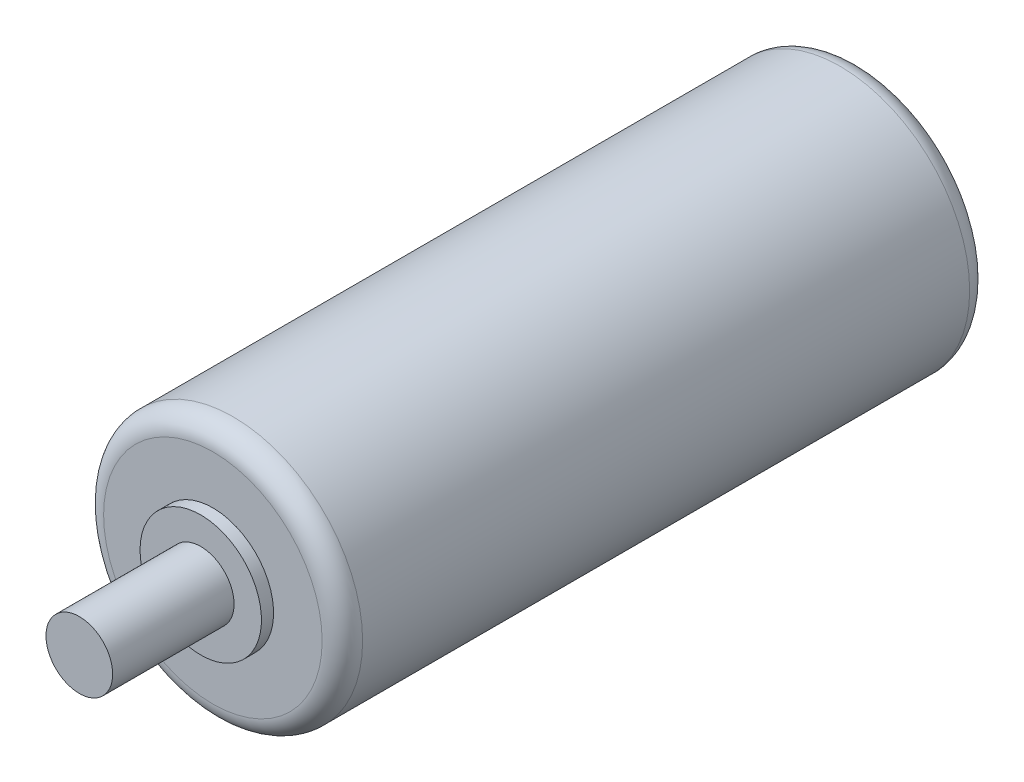
ISO-10303-21;
HEADER;
FILE_DESCRIPTION(('STEP AP214'),'2;1');
FILE_NAME('part.step','',(''),(''),'','','');
FILE_SCHEMA(('AUTOMOTIVE_DESIGN { 1 0 10303 214 1 1 1 1 }'));
ENDSEC;
DATA;
#1=APPLICATION_CONTEXT('core data for automotive mechanical design processes');
#2=APPLICATION_PROTOCOL_DEFINITION('international standard','automotive_design',2000,#1);
#3=PRODUCT_CONTEXT('',#1,'mechanical');
#4=PRODUCT('Part','Part','',(#3));
#5=PRODUCT_RELATED_PRODUCT_CATEGORY('part','',(#4));
#6=PRODUCT_DEFINITION_FORMATION('','',#4);
#7=PRODUCT_DEFINITION_CONTEXT('part definition',#1,'design');
#8=PRODUCT_DEFINITION('design','',#6,#7);
#9=PRODUCT_DEFINITION_SHAPE('','',#8);
#10=(LENGTH_UNIT() NAMED_UNIT(*) SI_UNIT(.MILLI.,.METRE.));
#11=(NAMED_UNIT(*) PLANE_ANGLE_UNIT() SI_UNIT($,.RADIAN.));
#12=(NAMED_UNIT(*) SI_UNIT($,.STERADIAN.) SOLID_ANGLE_UNIT());
#13=UNCERTAINTY_MEASURE_WITH_UNIT(LENGTH_MEASURE(1.E-05),#10,'distance_accuracy_value','');
#14=(GEOMETRIC_REPRESENTATION_CONTEXT(3) GLOBAL_UNCERTAINTY_ASSIGNED_CONTEXT((#13)) GLOBAL_UNIT_ASSIGNED_CONTEXT((#10,
#11,#12)) REPRESENTATION_CONTEXT('',''));
#15=CARTESIAN_POINT('',(0.,0.,0.));
#16=DIRECTION('',(0.,0.,1.));
#17=DIRECTION('',(1.,0.,0.));
#18=AXIS2_PLACEMENT_3D('',#15,#16,#17);
#19=CARTESIAN_POINT('',(0.,0.,113.));
#20=DIRECTION('',(0.,0.,1.));
#21=DIRECTION('',(1.,0.,0.));
#22=AXIS2_PLACEMENT_3D('',#19,#20,#21);
#23=PLANE('',#22);
#24=CARTESIAN_POINT('',(0.,0.,113.));
#25=DIRECTION('',(0.,0.,-1.));
#26=DIRECTION('',(-1.,0.,0.));
#27=AXIS2_PLACEMENT_3D('',#24,#25,#26);
#28=CIRCLE('',#27,8.23645878482906);
#29=CARTESIAN_POINT('',(-8.23645878482906,0.,113.));
#30=VERTEX_POINT('',#29);
#31=EDGE_CURVE('E87',#30,#30,#28,.T.);
#32=ORIENTED_EDGE('',*,*,#31,.F.);
#33=EDGE_LOOP('',(#32));
#34=FACE_BOUND('',#33,.T.);
#35=ADVANCED_FACE('F17',(#34),#23,.T.);
#36=CARTESIAN_POINT('',(0.,-3.,-56.));
#37=DIRECTION('',(0.,0.,-1.));
#38=DIRECTION('',(-1.,0.,0.));
#39=AXIS2_PLACEMENT_3D('',#36,#37,#38);
#40=PLANE('',#39);
#41=CARTESIAN_POINT('',(0.,3.,-56.));
#42=DIRECTION('',(0.,0.,-1.));
#43=DIRECTION('',(-1.,0.,0.));
#44=AXIS2_PLACEMENT_3D('',#41,#42,#43);
#45=CIRCLE('',#44,7.77817459305202);
#46=CARTESIAN_POINT('',(-5.5,8.5,-56.));
#47=VERTEX_POINT('',#46);
#48=CARTESIAN_POINT('',(5.5,8.5,-56.));
#49=VERTEX_POINT('',#48);
#50=EDGE_CURVE('E75',#47,#49,#45,.T.);
#51=ORIENTED_EDGE('',*,*,#50,.T.);
#52=DIRECTION('',(0.,1.,0.));
#53=VECTOR('',#52,1.);
#54=CARTESIAN_POINT('',(5.5,8.5,-56.));
#55=LINE('',#54,#53);
#56=CARTESIAN_POINT('',(5.5,-8.5,-56.));
#57=VERTEX_POINT('',#56);
#58=EDGE_CURVE('E69',#49,#57,#55,.F.);
#59=ORIENTED_EDGE('',*,*,#58,.T.);
#60=CARTESIAN_POINT('',(0.,-3.,-56.));
#61=DIRECTION('',(0.,0.,-1.));
#62=DIRECTION('',(-1.,0.,0.));
#63=AXIS2_PLACEMENT_3D('',#60,#61,#62);
#64=CIRCLE('',#63,7.77817459305203);
#65=CARTESIAN_POINT('',(-5.5,-8.5,-56.));
#66=VERTEX_POINT('',#65);
#67=EDGE_CURVE('E72',#57,#66,#64,.T.);
#68=ORIENTED_EDGE('',*,*,#67,.T.);
#69=DIRECTION('',(0.,-1.,0.));
#70=VECTOR('',#69,1.);
#71=CARTESIAN_POINT('',(-5.5,8.5,-56.));
#72=LINE('',#71,#70);
#73=EDGE_CURVE('E99',#66,#47,#72,.F.);
#74=ORIENTED_EDGE('',*,*,#73,.T.);
#75=EDGE_LOOP('',(#51,#59,#68,#74));
#76=FACE_BOUND('',#75,.T.);
#77=ADVANCED_FACE('F71',(#76),#40,.T.);
#78=CARTESIAN_POINT('',(0.,0.,113.));
#79=DIRECTION('',(0.,0.,-1.));
#80=DIRECTION('',(-1.,0.,0.));
#81=AXIS2_PLACEMENT_3D('',#78,#79,#80);
#82=CYLINDRICAL_SURFACE('',#81,8.23645878482906);
#83=CARTESIAN_POINT('',(0.,0.,83.));
#84=DIRECTION('',(0.,0.,-1.));
#85=DIRECTION('',(-1.,0.,0.));
#86=AXIS2_PLACEMENT_3D('',#83,#84,#85);
#87=CIRCLE('',#86,8.23645878482906);
#88=CARTESIAN_POINT('',(-8.23645878482906,0.,83.));
#89=VERTEX_POINT('',#88);
#90=EDGE_CURVE('E121',#89,#89,#87,.T.);
#91=ORIENTED_EDGE('',*,*,#90,.F.);
#92=EDGE_LOOP('',(#91));
#93=FACE_BOUND('',#92,.T.);
#94=ORIENTED_EDGE('',*,*,#31,.T.);
#95=EDGE_LOOP('',(#94));
#96=FACE_BOUND('',#95,.T.);
#97=ADVANCED_FACE('F339',(#93,#96),#82,.T.);
#98=CARTESIAN_POINT('',(0.,-3.,-56.));
#99=DIRECTION('',(0.,0.,-1.));
#100=DIRECTION('',(-1.,0.,0.));
#101=AXIS2_PLACEMENT_3D('',#98,#99,#100);
#102=CYLINDRICAL_SURFACE('',#101,7.77817459305203);
#103=DIRECTION('',(0.,0.,1.));
#104=VECTOR('',#103,1.);
#105=CARTESIAN_POINT('',(-5.5,-8.5,-56.));
#106=LINE('',#105,#104);
#107=CARTESIAN_POINT('',(-5.5,-8.5,-86.));
#108=VERTEX_POINT('',#107);
#109=EDGE_CURVE('E85',#108,#66,#106,.T.);
#110=ORIENTED_EDGE('',*,*,#109,.T.);
#111=ORIENTED_EDGE('',*,*,#67,.F.);
#112=DIRECTION('',(0.,0.,1.));
#113=VECTOR('',#112,1.);
#114=CARTESIAN_POINT('',(5.5,-8.5,-56.));
#115=LINE('',#114,#113);
#116=CARTESIAN_POINT('',(5.5,-8.5,-86.));
#117=VERTEX_POINT('',#116);
#118=EDGE_CURVE('E79',#57,#117,#115,.F.);
#119=ORIENTED_EDGE('',*,*,#118,.T.);
#120=CARTESIAN_POINT('',(0.,-3.,-86.));
#121=DIRECTION('',(0.,0.,-1.));
#122=DIRECTION('',(-1.,0.,0.));
#123=AXIS2_PLACEMENT_3D('',#120,#121,#122);
#124=CIRCLE('',#123,7.77817459305203);
#125=EDGE_CURVE('E119',#108,#117,#124,.F.);
#126=ORIENTED_EDGE('',*,*,#125,.F.);
#127=EDGE_LOOP('',(#110,#111,#119,#126));
#128=FACE_BOUND('',#127,.T.);
#129=ADVANCED_FACE('F82',(#128),#102,.F.);
#130=CARTESIAN_POINT('',(5.5,8.5,-56.));
#131=DIRECTION('',(1.,0.,0.));
#132=DIRECTION('',(0.,1.,0.));
#133=AXIS2_PLACEMENT_3D('',#130,#131,#132);
#134=PLANE('',#133);
#135=ORIENTED_EDGE('',*,*,#118,.F.);
#136=ORIENTED_EDGE('',*,*,#58,.F.);
#137=DIRECTION('',(0.,0.,-1.));
#138=VECTOR('',#137,1.);
#139=CARTESIAN_POINT('',(5.5,8.5,-56.));
#140=LINE('',#139,#138);
#141=CARTESIAN_POINT('',(5.5,8.5,-86.));
#142=VERTEX_POINT('',#141);
#143=EDGE_CURVE('E94',#49,#142,#140,.T.);
#144=ORIENTED_EDGE('',*,*,#143,.T.);
#145=DIRECTION('',(0.,1.,0.));
#146=VECTOR('',#145,1.);
#147=CARTESIAN_POINT('',(5.5,0.,-86.));
#148=LINE('',#147,#146);
#149=EDGE_CURVE('E91',#117,#142,#148,.T.);
#150=ORIENTED_EDGE('',*,*,#149,.F.);
#151=EDGE_LOOP('',(#135,#136,#144,#150));
#152=FACE_BOUND('',#151,.T.);
#153=ADVANCED_FACE('F89',(#152),#134,.F.);
#154=CARTESIAN_POINT('',(0.,3.,-56.));
#155=DIRECTION('',(0.,0.,-1.));
#156=DIRECTION('',(-1.,0.,0.));
#157=AXIS2_PLACEMENT_3D('',#154,#155,#156);
#158=CYLINDRICAL_SURFACE('',#157,7.77817459305202);
#159=ORIENTED_EDGE('',*,*,#143,.F.);
#160=ORIENTED_EDGE('',*,*,#50,.F.);
#161=DIRECTION('',(0.,0.,1.));
#162=VECTOR('',#161,1.);
#163=CARTESIAN_POINT('',(-5.5,8.5,-56.));
#164=LINE('',#163,#162);
#165=CARTESIAN_POINT('',(-5.5,8.5,-86.));
#166=VERTEX_POINT('',#165);
#167=EDGE_CURVE('E100',#47,#166,#164,.F.);
#168=ORIENTED_EDGE('',*,*,#167,.T.);
#169=CARTESIAN_POINT('',(0.,3.,-86.));
#170=DIRECTION('',(0.,0.,-1.));
#171=DIRECTION('',(-1.,0.,0.));
#172=AXIS2_PLACEMENT_3D('',#169,#170,#171);
#173=CIRCLE('',#172,7.77817459305202);
#174=EDGE_CURVE('E116',#142,#166,#173,.F.);
#175=ORIENTED_EDGE('',*,*,#174,.F.);
#176=EDGE_LOOP('',(#159,#160,#168,#175));
#177=FACE_BOUND('',#176,.T.);
#178=ADVANCED_FACE('F225',(#177),#158,.F.);
#179=CARTESIAN_POINT('',(-5.5,8.5,-56.));
#180=DIRECTION('',(-1.,0.,0.));
#181=DIRECTION('',(0.,-1.,0.));
#182=AXIS2_PLACEMENT_3D('',#179,#180,#181);
#183=PLANE('',#182);
#184=ORIENTED_EDGE('',*,*,#167,.F.);
#185=ORIENTED_EDGE('',*,*,#73,.F.);
#186=ORIENTED_EDGE('',*,*,#109,.F.);
#187=DIRECTION('',(0.,1.,0.));
#188=VECTOR('',#187,1.);
#189=CARTESIAN_POINT('',(-5.5,0.,-86.));
#190=LINE('',#189,#188);
#191=EDGE_CURVE('E115',#166,#108,#190,.F.);
#192=ORIENTED_EDGE('',*,*,#191,.F.);
#193=EDGE_LOOP('',(#184,#185,#186,#192));
#194=FACE_BOUND('',#193,.T.);
#195=ADVANCED_FACE('F231',(#194),#183,.F.);
#196=CARTESIAN_POINT('',(0.,0.,83.));
#197=DIRECTION('',(0.,0.,1.));
#198=DIRECTION('',(1.,0.,0.));
#199=AXIS2_PLACEMENT_3D('',#196,#197,#198);
#200=PLANE('',#199);
#201=CARTESIAN_POINT('',(0.,0.,83.));
#202=DIRECTION('',(0.,0.,-1.));
#203=DIRECTION('',(-1.,0.,0.));
#204=AXIS2_PLACEMENT_3D('',#201,#202,#203);
#205=CIRCLE('',#204,15.);
#206=CARTESIAN_POINT('',(-15.,0.,83.));
#207=VERTEX_POINT('',#206);
#208=EDGE_CURVE('E112',#207,#207,#205,.T.);
#209=ORIENTED_EDGE('',*,*,#208,.F.);
#210=EDGE_LOOP('',(#209));
#211=FACE_BOUND('',#210,.T.);
#212=ORIENTED_EDGE('',*,*,#90,.T.);
#213=EDGE_LOOP('',(#212));
#214=FACE_BOUND('',#213,.T.);
#215=ADVANCED_FACE('F233',(#211,#214),#200,.T.);
#216=CARTESIAN_POINT('',(0.,0.,-86.));
#217=DIRECTION('',(0.,0.,-1.));
#218=DIRECTION('',(-1.,0.,0.));
#219=AXIS2_PLACEMENT_3D('',#216,#217,#218);
#220=PLANE('',#219);
#221=CARTESIAN_POINT('',(0.,0.,-86.));
#222=DIRECTION('',(0.,0.,1.));
#223=DIRECTION('',(1.,0.,0.));
#224=AXIS2_PLACEMENT_3D('',#221,#222,#223);
#225=CIRCLE('',#224,17.75);
#226=CARTESIAN_POINT('',(17.75,0.,-86.));
#227=VERTEX_POINT('',#226);
#228=EDGE_CURVE('E109',#227,#227,#225,.T.);
#229=ORIENTED_EDGE('',*,*,#228,.F.);
#230=EDGE_LOOP('',(#229));
#231=FACE_BOUND('',#230,.T.);
#232=ORIENTED_EDGE('',*,*,#174,.T.);
#233=ORIENTED_EDGE('',*,*,#191,.T.);
#234=ORIENTED_EDGE('',*,*,#125,.T.);
#235=ORIENTED_EDGE('',*,*,#149,.T.);
#236=EDGE_LOOP('',(#232,#233,#234,#235));
#237=FACE_BOUND('',#236,.T.);
#238=ADVANCED_FACE('F229',(#231,#237),#220,.T.);
#239=CARTESIAN_POINT('',(0.,0.,83.));
#240=DIRECTION('',(0.,0.,-1.));
#241=DIRECTION('',(-1.,0.,0.));
#242=AXIS2_PLACEMENT_3D('',#239,#240,#241);
#243=CYLINDRICAL_SURFACE('',#242,15.);
#244=CARTESIAN_POINT('',(0.,0.,80.));
#245=DIRECTION('',(0.,0.,-1.));
#246=DIRECTION('',(-1.,0.,0.));
#247=AXIS2_PLACEMENT_3D('',#244,#245,#246);
#248=CIRCLE('',#247,15.);
#249=CARTESIAN_POINT('',(-15.,0.,80.));
#250=VERTEX_POINT('',#249);
#251=EDGE_CURVE('E106',#250,#250,#248,.T.);
#252=ORIENTED_EDGE('',*,*,#251,.F.);
#253=EDGE_LOOP('',(#252));
#254=FACE_BOUND('',#253,.T.);
#255=ORIENTED_EDGE('',*,*,#208,.T.);
#256=EDGE_LOOP('',(#255));
#257=FACE_BOUND('',#256,.T.);
#258=ADVANCED_FACE('F294',(#254,#257),#243,.T.);
#259=CARTESIAN_POINT('',(0.,0.,-86.));
#260=DIRECTION('',(0.,0.,1.));
#261=DIRECTION('',(1.,0.,0.));
#262=AXIS2_PLACEMENT_3D('',#259,#260,#261);
#263=CYLINDRICAL_SURFACE('',#262,17.75);
#264=ORIENTED_EDGE('',*,*,#228,.T.);
#265=EDGE_LOOP('',(#264));
#266=FACE_BOUND('',#265,.T.);
#267=CARTESIAN_POINT('',(0.,0.,-80.));
#268=DIRECTION('',(0.,0.,1.));
#269=DIRECTION('',(1.,0.,0.));
#270=AXIS2_PLACEMENT_3D('',#267,#268,#269);
#271=CIRCLE('',#270,17.75);
#272=CARTESIAN_POINT('',(17.75,0.,-80.));
#273=VERTEX_POINT('',#272);
#274=EDGE_CURVE('E102',#273,#273,#271,.F.);
#275=ORIENTED_EDGE('',*,*,#274,.T.);
#276=EDGE_LOOP('',(#275));
#277=FACE_BOUND('',#276,.T.);
#278=ADVANCED_FACE('F287',(#266,#277),#263,.T.);
#279=CARTESIAN_POINT('',(0.,0.,80.));
#280=DIRECTION('',(0.,0.,1.));
#281=DIRECTION('',(1.,0.,0.));
#282=AXIS2_PLACEMENT_3D('',#279,#280,#281);
#283=PLANE('',#282);
#284=CARTESIAN_POINT('',(0.,0.,80.));
#285=DIRECTION('',(0.,0.,-1.));
#286=DIRECTION('',(-1.,0.,0.));
#287=AXIS2_PLACEMENT_3D('',#284,#285,#286);
#288=CIRCLE('',#287,27.);
#289=CARTESIAN_POINT('',(-27.,0.,80.));
#290=VERTEX_POINT('',#289);
#291=CARTESIAN_POINT('',(27.,0.,80.));
#292=VERTEX_POINT('',#291);
#293=EDGE_CURVE('E190',#290,#292,#288,.T.);
#294=ORIENTED_EDGE('',*,*,#293,.F.);
#295=CARTESIAN_POINT('',(0.,0.,80.));
#296=DIRECTION('',(0.,0.,-1.));
#297=DIRECTION('',(1.,0.,0.));
#298=AXIS2_PLACEMENT_3D('',#295,#296,#297);
#299=CIRCLE('',#298,27.);
#300=EDGE_CURVE('E105',#292,#290,#299,.T.);
#301=ORIENTED_EDGE('',*,*,#300,.F.);
#302=EDGE_LOOP('',(#294,#301));
#303=FACE_BOUND('',#302,.T.);
#304=ORIENTED_EDGE('',*,*,#251,.T.);
#305=EDGE_LOOP('',(#304));
#306=FACE_BOUND('',#305,.T.);
#307=ADVANCED_FACE('F166',(#303,#306),#283,.T.);
#308=CARTESIAN_POINT('',(0.,0.,-80.));
#309=DIRECTION('',(0.,0.,1.));
#310=DIRECTION('',(1.,0.,0.));
#311=AXIS2_PLACEMENT_3D('',#308,#309,#310);
#312=PLANE('',#311);
#313=CARTESIAN_POINT('',(0.,0.,-80.));
#314=DIRECTION('',(0.,0.,1.));
#315=DIRECTION('',(1.,0.,0.));
#316=AXIS2_PLACEMENT_3D('',#313,#314,#315);
#317=CIRCLE('',#316,27.);
#318=CARTESIAN_POINT('',(27.,0.,-80.));
#319=VERTEX_POINT('',#318);
#320=CARTESIAN_POINT('',(-27.,0.,-80.));
#321=VERTEX_POINT('',#320);
#322=EDGE_CURVE('E153',#319,#321,#317,.T.);
#323=ORIENTED_EDGE('',*,*,#322,.F.);
#324=CARTESIAN_POINT('',(0.,0.,-80.));
#325=DIRECTION('',(0.,0.,1.));
#326=DIRECTION('',(-1.,0.,0.));
#327=AXIS2_PLACEMENT_3D('',#324,#325,#326);
#328=CIRCLE('',#327,27.);
#329=EDGE_CURVE('E36',#321,#319,#328,.T.);
#330=ORIENTED_EDGE('',*,*,#329,.F.);
#331=EDGE_LOOP('',(#323,#330));
#332=FACE_BOUND('',#331,.T.);
#333=ORIENTED_EDGE('',*,*,#274,.F.);
#334=EDGE_LOOP('',(#333));
#335=FACE_BOUND('',#334,.T.);
#336=ADVANCED_FACE('F157',(#332,#335),#312,.F.);
#337=CARTESIAN_POINT('',(0.,0.,75.));
#338=DIRECTION('',(0.,0.,1.));
#339=DIRECTION('',(1.,0.,0.));
#340=AXIS2_PLACEMENT_3D('',#337,#338,#339);
#341=TOROIDAL_SURFACE('',#340,27.,5.);
#342=ORIENTED_EDGE('',*,*,#300,.T.);
#343=ORIENTED_EDGE('',*,*,#293,.T.);
#344=EDGE_LOOP('',(#342,#343));
#345=FACE_BOUND('',#344,.T.);
#346=CARTESIAN_POINT('',(0.,0.,75.));
#347=DIRECTION('',(0.,0.,-1.));
#348=DIRECTION('',(-1.,0.,0.));
#349=AXIS2_PLACEMENT_3D('',#346,#347,#348);
#350=CIRCLE('',#349,32.);
#351=CARTESIAN_POINT('',(-32.,0.,75.));
#352=VERTEX_POINT('',#351);
#353=EDGE_CURVE('E28',#352,#352,#350,.T.);
#354=ORIENTED_EDGE('',*,*,#353,.F.);
#355=EDGE_LOOP('',(#354));
#356=FACE_BOUND('',#355,.T.);
#357=ADVANCED_FACE('F142',(#345,#356),#341,.T.);
#358=CARTESIAN_POINT('',(0.,0.,-75.));
#359=DIRECTION('',(0.,0.,1.));
#360=DIRECTION('',(1.,0.,0.));
#361=AXIS2_PLACEMENT_3D('',#358,#359,#360);
#362=TOROIDAL_SURFACE('',#361,27.,5.);
#363=CARTESIAN_POINT('',(0.,0.,-75.));
#364=DIRECTION('',(0.,0.,-1.));
#365=DIRECTION('',(-1.,0.,0.));
#366=AXIS2_PLACEMENT_3D('',#363,#364,#365);
#367=CIRCLE('',#366,32.);
#368=CARTESIAN_POINT('',(-32.,0.,-75.));
#369=VERTEX_POINT('',#368);
#370=EDGE_CURVE('E11',#369,#369,#367,.F.);
#371=ORIENTED_EDGE('',*,*,#370,.F.);
#372=EDGE_LOOP('',(#371));
#373=FACE_BOUND('',#372,.T.);
#374=ORIENTED_EDGE('',*,*,#322,.T.);
#375=ORIENTED_EDGE('',*,*,#329,.T.);
#376=EDGE_LOOP('',(#374,#375));
#377=FACE_BOUND('',#376,.T.);
#378=ADVANCED_FACE('F131',(#373,#377),#362,.T.);
#379=CARTESIAN_POINT('',(0.,0.,80.));
#380=DIRECTION('',(0.,0.,-1.));
#381=DIRECTION('',(-1.,0.,0.));
#382=AXIS2_PLACEMENT_3D('',#379,#380,#381);
#383=CYLINDRICAL_SURFACE('',#382,32.);
#384=ORIENTED_EDGE('',*,*,#370,.T.);
#385=EDGE_LOOP('',(#384));
#386=FACE_BOUND('',#385,.T.);
#387=ORIENTED_EDGE('',*,*,#353,.T.);
#388=EDGE_LOOP('',(#387));
#389=FACE_BOUND('',#388,.T.);
#390=ADVANCED_FACE('F141',(#386,#389),#383,.T.);
#391=CLOSED_SHELL('',(#35,#77,#97,#129,#153,#178,#195,#215,#238,#258,#278,#307,#336,#357,#378,#390));
#392=MANIFOLD_SOLID_BREP('B1',#391);
#393=ADVANCED_BREP_SHAPE_REPRESENTATION('',(#18,#392),#14);
#394=SHAPE_DEFINITION_REPRESENTATION(#9,#393);
ENDSEC;
END-ISO-10303-21;
